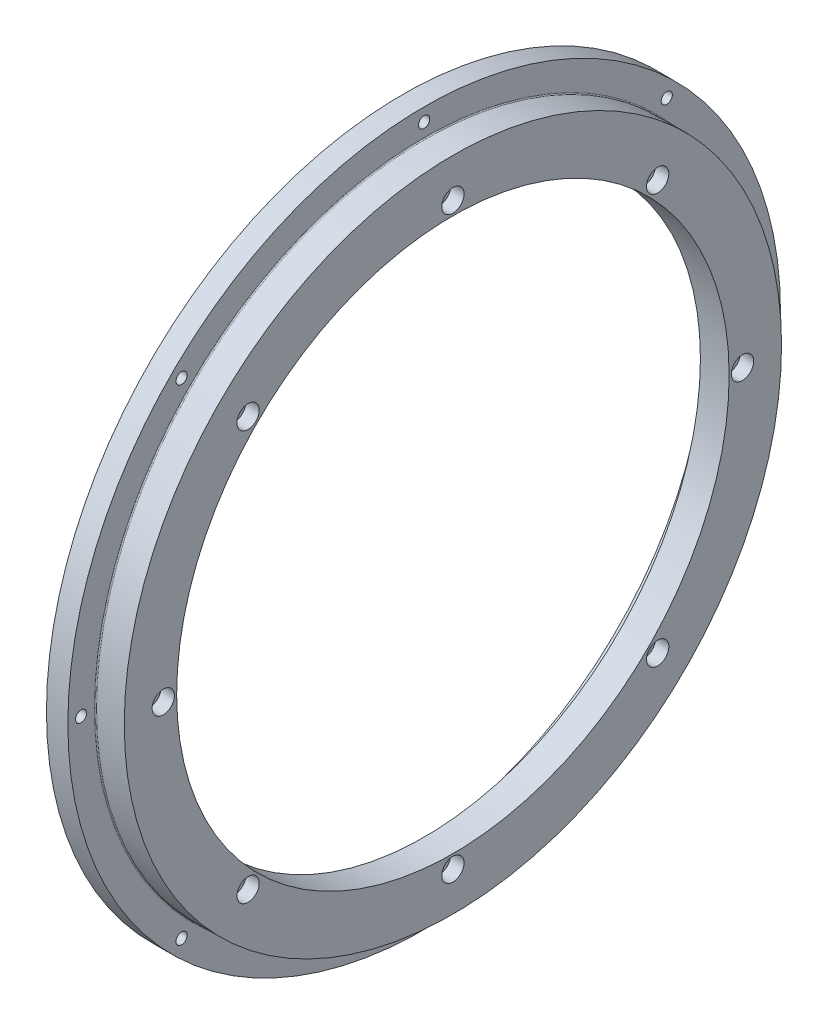
ISO-10303-21;
HEADER;
FILE_DESCRIPTION(('STEP AP214'),'2;1');
FILE_NAME('part.step','',(''),(''),'','','');
FILE_SCHEMA(('AUTOMOTIVE_DESIGN { 1 0 10303 214 1 1 1 1 }'));
ENDSEC;
DATA;
#1=APPLICATION_CONTEXT('core data for automotive mechanical design processes');
#2=APPLICATION_PROTOCOL_DEFINITION('international standard','automotive_design',2000,#1);
#3=PRODUCT_CONTEXT('',#1,'mechanical');
#4=PRODUCT('Part','Part','',(#3));
#5=PRODUCT_RELATED_PRODUCT_CATEGORY('part','',(#4));
#6=PRODUCT_DEFINITION_FORMATION('','',#4);
#7=PRODUCT_DEFINITION_CONTEXT('part definition',#1,'design');
#8=PRODUCT_DEFINITION('design','',#6,#7);
#9=PRODUCT_DEFINITION_SHAPE('','',#8);
#10=(LENGTH_UNIT() NAMED_UNIT(*) SI_UNIT(.MILLI.,.METRE.));
#11=(NAMED_UNIT(*) PLANE_ANGLE_UNIT() SI_UNIT($,.RADIAN.));
#12=(NAMED_UNIT(*) SI_UNIT($,.STERADIAN.) SOLID_ANGLE_UNIT());
#13=UNCERTAINTY_MEASURE_WITH_UNIT(LENGTH_MEASURE(1.E-05),#10,'distance_accuracy_value','');
#14=(GEOMETRIC_REPRESENTATION_CONTEXT(3) GLOBAL_UNCERTAINTY_ASSIGNED_CONTEXT((#13)) GLOBAL_UNIT_ASSIGNED_CONTEXT((#10,
#11,#12)) REPRESENTATION_CONTEXT('',''));
#15=CARTESIAN_POINT('',(0.,0.,0.));
#16=DIRECTION('',(0.,0.,1.));
#17=DIRECTION('',(1.,0.,0.));
#18=AXIS2_PLACEMENT_3D('',#15,#16,#17);
#19=CARTESIAN_POINT('',(-17.8562,-145.9291722,-145.9291722));
#20=DIRECTION('',(1.,0.,0.));
#21=DIRECTION('',(0.,0.,-1.));
#22=AXIS2_PLACEMENT_3D('',#19,#20,#21);
#23=CYLINDRICAL_SURFACE('',#22,5.1562);
#24=CARTESIAN_POINT('',(-2.6162,-145.9291722,-145.9291722));
#25=DIRECTION('',(1.,0.,0.));
#26=DIRECTION('',(0.,0.,-1.));
#27=AXIS2_PLACEMENT_3D('',#24,#25,#26);
#28=CIRCLE('',#27,5.1562);
#29=CARTESIAN_POINT('',(-2.6162,-145.9291722,-151.0853722));
#30=VERTEX_POINT('',#29);
#31=EDGE_CURVE('E84',#30,#30,#28,.T.);
#32=ORIENTED_EDGE('',*,*,#31,.F.);
#33=EDGE_LOOP('',(#32));
#34=FACE_BOUND('',#33,.T.);
#35=CARTESIAN_POINT('',(8.3312,-145.9291722,-145.9291722));
#36=DIRECTION('',(1.,0.,0.));
#37=DIRECTION('',(0.,0.,-1.));
#38=AXIS2_PLACEMENT_3D('',#35,#36,#37);
#39=CIRCLE('',#38,5.1562);
#40=CARTESIAN_POINT('',(8.3312,-145.9291722,-151.0853722));
#41=VERTEX_POINT('',#40);
#42=EDGE_CURVE('E45',#41,#41,#39,.F.);
#43=ORIENTED_EDGE('',*,*,#42,.F.);
#44=EDGE_LOOP('',(#43));
#45=FACE_BOUND('',#44,.T.);
#46=ADVANCED_FACE('F41',(#34,#45),#23,.F.);
#47=CARTESIAN_POINT('',(-17.8562,-206.375,0.));
#48=DIRECTION('',(1.,0.,0.));
#49=DIRECTION('',(0.,0.,-1.));
#50=AXIS2_PLACEMENT_3D('',#47,#48,#49);
#51=CYLINDRICAL_SURFACE('',#50,5.1562);
#52=CARTESIAN_POINT('',(-2.6162,-206.375,0.));
#53=DIRECTION('',(1.,0.,0.));
#54=DIRECTION('',(0.,0.,-1.));
#55=AXIS2_PLACEMENT_3D('',#52,#53,#54);
#56=CIRCLE('',#55,5.1562);
#57=CARTESIAN_POINT('',(-2.6162,-206.375,-5.1562));
#58=VERTEX_POINT('',#57);
#59=EDGE_CURVE('E87',#58,#58,#56,.T.);
#60=ORIENTED_EDGE('',*,*,#59,.F.);
#61=EDGE_LOOP('',(#60));
#62=FACE_BOUND('',#61,.T.);
#63=CARTESIAN_POINT('',(8.3312,-206.375,0.));
#64=DIRECTION('',(1.,0.,0.));
#65=DIRECTION('',(0.,0.,-1.));
#66=AXIS2_PLACEMENT_3D('',#63,#64,#65);
#67=CIRCLE('',#66,5.1562);
#68=CARTESIAN_POINT('',(8.3312,-206.375,-5.1562));
#69=VERTEX_POINT('',#68);
#70=EDGE_CURVE('E127',#69,#69,#67,.F.);
#71=ORIENTED_EDGE('',*,*,#70,.F.);
#72=EDGE_LOOP('',(#71));
#73=FACE_BOUND('',#72,.T.);
#74=ADVANCED_FACE('F137',(#62,#73),#51,.F.);
#75=CARTESIAN_POINT('',(-17.8562,-145.9291722,145.9291722));
#76=DIRECTION('',(1.,0.,0.));
#77=DIRECTION('',(0.,0.,-1.));
#78=AXIS2_PLACEMENT_3D('',#75,#76,#77);
#79=CYLINDRICAL_SURFACE('',#78,5.1562);
#80=CARTESIAN_POINT('',(-2.6162,-145.9291722,145.9291722));
#81=DIRECTION('',(1.,0.,0.));
#82=DIRECTION('',(0.,0.,-1.));
#83=AXIS2_PLACEMENT_3D('',#80,#81,#82);
#84=CIRCLE('',#83,5.1562);
#85=CARTESIAN_POINT('',(-2.6162,-145.9291722,140.7729722));
#86=VERTEX_POINT('',#85);
#87=EDGE_CURVE('E90',#86,#86,#84,.T.);
#88=ORIENTED_EDGE('',*,*,#87,.F.);
#89=EDGE_LOOP('',(#88));
#90=FACE_BOUND('',#89,.T.);
#91=CARTESIAN_POINT('',(8.3312,-145.9291722,145.9291722));
#92=DIRECTION('',(1.,0.,0.));
#93=DIRECTION('',(0.,0.,-1.));
#94=AXIS2_PLACEMENT_3D('',#91,#92,#93);
#95=CIRCLE('',#94,5.1562);
#96=CARTESIAN_POINT('',(8.3312,-145.9291722,140.7729722));
#97=VERTEX_POINT('',#96);
#98=EDGE_CURVE('E125',#97,#97,#95,.F.);
#99=ORIENTED_EDGE('',*,*,#98,.F.);
#100=EDGE_LOOP('',(#99));
#101=FACE_BOUND('',#100,.T.);
#102=ADVANCED_FACE('F144',(#90,#101),#79,.F.);
#103=CARTESIAN_POINT('',(-17.8562,0.,206.375));
#104=DIRECTION('',(1.,0.,0.));
#105=DIRECTION('',(0.,0.,-1.));
#106=AXIS2_PLACEMENT_3D('',#103,#104,#105);
#107=CYLINDRICAL_SURFACE('',#106,5.1562);
#108=CARTESIAN_POINT('',(-2.6162,0.,206.375));
#109=DIRECTION('',(1.,0.,0.));
#110=DIRECTION('',(0.,0.,-1.));
#111=AXIS2_PLACEMENT_3D('',#108,#109,#110);
#112=CIRCLE('',#111,5.1562);
#113=CARTESIAN_POINT('',(-2.6162,0.,201.2188));
#114=VERTEX_POINT('',#113);
#115=EDGE_CURVE('E93',#114,#114,#112,.T.);
#116=ORIENTED_EDGE('',*,*,#115,.F.);
#117=EDGE_LOOP('',(#116));
#118=FACE_BOUND('',#117,.T.);
#119=CARTESIAN_POINT('',(8.3312,0.,206.375));
#120=DIRECTION('',(1.,0.,0.));
#121=DIRECTION('',(0.,0.,-1.));
#122=AXIS2_PLACEMENT_3D('',#119,#120,#121);
#123=CIRCLE('',#122,5.1562);
#124=CARTESIAN_POINT('',(8.3312,0.,201.2188));
#125=VERTEX_POINT('',#124);
#126=EDGE_CURVE('E122',#125,#125,#123,.F.);
#127=ORIENTED_EDGE('',*,*,#126,.F.);
#128=EDGE_LOOP('',(#127));
#129=FACE_BOUND('',#128,.T.);
#130=ADVANCED_FACE('F376',(#118,#129),#107,.F.);
#131=CARTESIAN_POINT('',(-17.8562,145.9291722,145.9291722));
#132=DIRECTION('',(1.,0.,0.));
#133=DIRECTION('',(0.,0.,-1.));
#134=AXIS2_PLACEMENT_3D('',#131,#132,#133);
#135=CYLINDRICAL_SURFACE('',#134,5.1562);
#136=CARTESIAN_POINT('',(-2.6162,145.9291722,145.9291722));
#137=DIRECTION('',(1.,0.,0.));
#138=DIRECTION('',(0.,0.,-1.));
#139=AXIS2_PLACEMENT_3D('',#136,#137,#138);
#140=CIRCLE('',#139,5.1562);
#141=CARTESIAN_POINT('',(-2.6162,145.9291722,140.7729722));
#142=VERTEX_POINT('',#141);
#143=EDGE_CURVE('E96',#142,#142,#140,.T.);
#144=ORIENTED_EDGE('',*,*,#143,.F.);
#145=EDGE_LOOP('',(#144));
#146=FACE_BOUND('',#145,.T.);
#147=CARTESIAN_POINT('',(8.3312,145.9291722,145.9291722));
#148=DIRECTION('',(1.,0.,0.));
#149=DIRECTION('',(0.,0.,-1.));
#150=AXIS2_PLACEMENT_3D('',#147,#148,#149);
#151=CIRCLE('',#150,5.1562);
#152=CARTESIAN_POINT('',(8.3312,145.9291722,140.7729722));
#153=VERTEX_POINT('',#152);
#154=EDGE_CURVE('E119',#153,#153,#151,.F.);
#155=ORIENTED_EDGE('',*,*,#154,.F.);
#156=EDGE_LOOP('',(#155));
#157=FACE_BOUND('',#156,.T.);
#158=ADVANCED_FACE('F372',(#146,#157),#135,.F.);
#159=CARTESIAN_POINT('',(-17.8562,206.375,0.));
#160=DIRECTION('',(1.,0.,0.));
#161=DIRECTION('',(0.,0.,-1.));
#162=AXIS2_PLACEMENT_3D('',#159,#160,#161);
#163=CYLINDRICAL_SURFACE('',#162,5.1562);
#164=CARTESIAN_POINT('',(-2.6162,206.375,0.));
#165=DIRECTION('',(1.,0.,0.));
#166=DIRECTION('',(0.,0.,-1.));
#167=AXIS2_PLACEMENT_3D('',#164,#165,#166);
#168=CIRCLE('',#167,5.1562);
#169=CARTESIAN_POINT('',(-2.6162,206.375,-5.1562));
#170=VERTEX_POINT('',#169);
#171=EDGE_CURVE('E99',#170,#170,#168,.T.);
#172=ORIENTED_EDGE('',*,*,#171,.F.);
#173=EDGE_LOOP('',(#172));
#174=FACE_BOUND('',#173,.T.);
#175=CARTESIAN_POINT('',(8.3312,206.375,0.));
#176=DIRECTION('',(1.,0.,0.));
#177=DIRECTION('',(0.,0.,-1.));
#178=AXIS2_PLACEMENT_3D('',#175,#176,#177);
#179=CIRCLE('',#178,5.1562);
#180=CARTESIAN_POINT('',(8.3312,206.375,-5.1562));
#181=VERTEX_POINT('',#180);
#182=EDGE_CURVE('E116',#181,#181,#179,.F.);
#183=ORIENTED_EDGE('',*,*,#182,.F.);
#184=EDGE_LOOP('',(#183));
#185=FACE_BOUND('',#184,.T.);
#186=ADVANCED_FACE('F368',(#174,#185),#163,.F.);
#187=CARTESIAN_POINT('',(-17.8562,145.9291722,-145.9291722));
#188=DIRECTION('',(1.,0.,0.));
#189=DIRECTION('',(0.,0.,-1.));
#190=AXIS2_PLACEMENT_3D('',#187,#188,#189);
#191=CYLINDRICAL_SURFACE('',#190,5.1562);
#192=CARTESIAN_POINT('',(-2.6162,145.9291722,-145.9291722));
#193=DIRECTION('',(1.,0.,0.));
#194=DIRECTION('',(0.,0.,-1.));
#195=AXIS2_PLACEMENT_3D('',#192,#193,#194);
#196=CIRCLE('',#195,5.1562);
#197=CARTESIAN_POINT('',(-2.6162,145.9291722,-151.0853722));
#198=VERTEX_POINT('',#197);
#199=EDGE_CURVE('E102',#198,#198,#196,.T.);
#200=ORIENTED_EDGE('',*,*,#199,.F.);
#201=EDGE_LOOP('',(#200));
#202=FACE_BOUND('',#201,.T.);
#203=CARTESIAN_POINT('',(8.3312,145.9291722,-145.9291722));
#204=DIRECTION('',(1.,0.,0.));
#205=DIRECTION('',(0.,0.,-1.));
#206=AXIS2_PLACEMENT_3D('',#203,#204,#205);
#207=CIRCLE('',#206,5.1562);
#208=CARTESIAN_POINT('',(8.3312,145.9291722,-151.0853722));
#209=VERTEX_POINT('',#208);
#210=EDGE_CURVE('E112',#209,#209,#207,.F.);
#211=ORIENTED_EDGE('',*,*,#210,.F.);
#212=EDGE_LOOP('',(#211));
#213=FACE_BOUND('',#212,.T.);
#214=ADVANCED_FACE('F364',(#202,#213),#191,.F.);
#215=CARTESIAN_POINT('',(-17.8562,0.,-206.375));
#216=DIRECTION('',(1.,0.,0.));
#217=DIRECTION('',(0.,0.,-1.));
#218=AXIS2_PLACEMENT_3D('',#215,#216,#217);
#219=CYLINDRICAL_SURFACE('',#218,5.1562);
#220=CARTESIAN_POINT('',(-2.6162,0.,-206.375));
#221=DIRECTION('',(1.,0.,0.));
#222=DIRECTION('',(0.,0.,-1.));
#223=AXIS2_PLACEMENT_3D('',#220,#221,#222);
#224=CIRCLE('',#223,5.1562);
#225=CARTESIAN_POINT('',(-2.6162,0.,-211.5312));
#226=VERTEX_POINT('',#225);
#227=EDGE_CURVE('E105',#226,#226,#224,.T.);
#228=ORIENTED_EDGE('',*,*,#227,.F.);
#229=EDGE_LOOP('',(#228));
#230=FACE_BOUND('',#229,.T.);
#231=CARTESIAN_POINT('',(8.3312,0.,-206.375));
#232=DIRECTION('',(1.,0.,0.));
#233=DIRECTION('',(0.,0.,-1.));
#234=AXIS2_PLACEMENT_3D('',#231,#232,#233);
#235=CIRCLE('',#234,5.1562);
#236=CARTESIAN_POINT('',(8.3312,0.,-211.5312));
#237=VERTEX_POINT('',#236);
#238=EDGE_CURVE('E109',#237,#237,#235,.F.);
#239=ORIENTED_EDGE('',*,*,#238,.F.);
#240=EDGE_LOOP('',(#239));
#241=FACE_BOUND('',#240,.T.);
#242=ADVANCED_FACE('F212',(#230,#241),#219,.F.);
#243=CARTESIAN_POINT('',(-17.8562,0.,-215.9127));
#244=DIRECTION('',(1.,0.,0.));
#245=DIRECTION('',(0.,0.,-1.));
#246=AXIS2_PLACEMENT_3D('',#243,#244,#245);
#247=PLANE('',#246);
#248=CARTESIAN_POINT('',(-17.8562,0.,-244.475));
#249=DIRECTION('',(1.,0.,0.));
#250=DIRECTION('',(0.,0.,-1.));
#251=AXIS2_PLACEMENT_3D('',#248,#249,#250);
#252=CIRCLE('',#251,3.96874999999999);
#253=CARTESIAN_POINT('',(-17.8562,0.,-248.44375));
#254=VERTEX_POINT('',#253);
#255=EDGE_CURVE('E62',#254,#254,#252,.T.);
#256=ORIENTED_EDGE('',*,*,#255,.T.);
#257=EDGE_LOOP('',(#256));
#258=FACE_BOUND('',#257,.T.);
#259=CARTESIAN_POINT('',(-17.8562,172.8699362,-172.8699362));
#260=DIRECTION('',(1.,0.,0.));
#261=DIRECTION('',(0.,0.,-1.));
#262=AXIS2_PLACEMENT_3D('',#259,#260,#261);
#263=CIRCLE('',#262,3.96874999999999);
#264=CARTESIAN_POINT('',(-17.8562,172.8699362,-176.8386862));
#265=VERTEX_POINT('',#264);
#266=EDGE_CURVE('E263',#265,#265,#263,.T.);
#267=ORIENTED_EDGE('',*,*,#266,.T.);
#268=EDGE_LOOP('',(#267));
#269=FACE_BOUND('',#268,.T.);
#270=CARTESIAN_POINT('',(-17.8562,244.475,0.));
#271=DIRECTION('',(1.,0.,0.));
#272=DIRECTION('',(0.,0.,-1.));
#273=AXIS2_PLACEMENT_3D('',#270,#271,#272);
#274=CIRCLE('',#273,3.96875);
#275=CARTESIAN_POINT('',(-17.8562,244.475,-3.96875));
#276=VERTEX_POINT('',#275);
#277=EDGE_CURVE('E260',#276,#276,#274,.T.);
#278=ORIENTED_EDGE('',*,*,#277,.T.);
#279=EDGE_LOOP('',(#278));
#280=FACE_BOUND('',#279,.T.);
#281=CARTESIAN_POINT('',(-17.8562,172.8699362,172.8699362));
#282=DIRECTION('',(1.,0.,0.));
#283=DIRECTION('',(0.,0.,-1.));
#284=AXIS2_PLACEMENT_3D('',#281,#282,#283);
#285=CIRCLE('',#284,3.96874999999999);
#286=CARTESIAN_POINT('',(-17.8562,172.8699362,168.9011862));
#287=VERTEX_POINT('',#286);
#288=EDGE_CURVE('E257',#287,#287,#285,.T.);
#289=ORIENTED_EDGE('',*,*,#288,.T.);
#290=EDGE_LOOP('',(#289));
#291=FACE_BOUND('',#290,.T.);
#292=CARTESIAN_POINT('',(-17.8562,0.,244.475));
#293=DIRECTION('',(1.,0.,0.));
#294=DIRECTION('',(0.,0.,-1.));
#295=AXIS2_PLACEMENT_3D('',#292,#293,#294);
#296=CIRCLE('',#295,3.96874999999999);
#297=CARTESIAN_POINT('',(-17.8562,0.,240.50625));
#298=VERTEX_POINT('',#297);
#299=EDGE_CURVE('E254',#298,#298,#296,.T.);
#300=ORIENTED_EDGE('',*,*,#299,.T.);
#301=EDGE_LOOP('',(#300));
#302=FACE_BOUND('',#301,.T.);
#303=CARTESIAN_POINT('',(-17.8562,-172.8699362,172.8699362));
#304=DIRECTION('',(1.,0.,0.));
#305=DIRECTION('',(0.,0.,-1.));
#306=AXIS2_PLACEMENT_3D('',#303,#304,#305);
#307=CIRCLE('',#306,3.96874999999999);
#308=CARTESIAN_POINT('',(-17.8562,-172.8699362,168.9011862));
#309=VERTEX_POINT('',#308);
#310=EDGE_CURVE('E251',#309,#309,#307,.T.);
#311=ORIENTED_EDGE('',*,*,#310,.T.);
#312=EDGE_LOOP('',(#311));
#313=FACE_BOUND('',#312,.T.);
#314=CARTESIAN_POINT('',(-17.8562,-244.475,0.));
#315=DIRECTION('',(1.,0.,0.));
#316=DIRECTION('',(0.,0.,-1.));
#317=AXIS2_PLACEMENT_3D('',#314,#315,#316);
#318=CIRCLE('',#317,3.96875);
#319=CARTESIAN_POINT('',(-17.8562,-244.475,-3.96875));
#320=VERTEX_POINT('',#319);
#321=EDGE_CURVE('E248',#320,#320,#318,.T.);
#322=ORIENTED_EDGE('',*,*,#321,.T.);
#323=EDGE_LOOP('',(#322));
#324=FACE_BOUND('',#323,.T.);
#325=CARTESIAN_POINT('',(-17.8562,-172.8699362,-172.8699362));
#326=DIRECTION('',(1.,0.,0.));
#327=DIRECTION('',(0.,0.,-1.));
#328=AXIS2_PLACEMENT_3D('',#325,#326,#327);
#329=CIRCLE('',#328,3.96874999999999);
#330=CARTESIAN_POINT('',(-17.8562,-172.8699362,-176.8386862));
#331=VERTEX_POINT('',#330);
#332=EDGE_CURVE('E108',#331,#331,#329,.T.);
#333=ORIENTED_EDGE('',*,*,#332,.T.);
#334=EDGE_LOOP('',(#333));
#335=FACE_BOUND('',#334,.T.);
#336=CARTESIAN_POINT('',(-17.8562,0.,0.));
#337=DIRECTION('',(-1.,0.,0.));
#338=DIRECTION('',(0.,0.,1.));
#339=AXIS2_PLACEMENT_3D('',#336,#337,#338);
#340=CIRCLE('',#339,215.9127);
#341=CARTESIAN_POINT('',(-17.8562,0.,215.9127));
#342=VERTEX_POINT('',#341);
#343=EDGE_CURVE('E83',#342,#342,#340,.T.);
#344=ORIENTED_EDGE('',*,*,#343,.F.);
#345=EDGE_LOOP('',(#344));
#346=FACE_BOUND('',#345,.T.);
#347=CARTESIAN_POINT('',(-17.8562,0.,0.));
#348=DIRECTION('',(-1.,0.,0.));
#349=DIRECTION('',(0.,0.,1.));
#350=AXIS2_PLACEMENT_3D('',#347,#348,#349);
#351=CIRCLE('',#350,253.9111);
#352=CARTESIAN_POINT('',(-17.8562,0.,253.9111));
#353=VERTEX_POINT('',#352);
#354=EDGE_CURVE('E227',#353,#353,#351,.T.);
#355=ORIENTED_EDGE('',*,*,#354,.T.);
#356=EDGE_LOOP('',(#355));
#357=FACE_BOUND('',#356,.T.);
#358=ADVANCED_FACE('F209',(#258,#269,#280,#291,#302,#313,#324,#335,#346,#357),#247,.F.);
#359=CARTESIAN_POINT('',(-43.2562,0.,0.));
#360=DIRECTION('',(-1.,0.,0.));
#361=DIRECTION('',(0.,0.,1.));
#362=AXIS2_PLACEMENT_3D('',#359,#360,#361);
#363=CYLINDRICAL_SURFACE('',#362,253.9111);
#364=ORIENTED_EDGE('',*,*,#354,.F.);
#365=EDGE_LOOP('',(#364));
#366=FACE_BOUND('',#365,.T.);
#367=CARTESIAN_POINT('',(-2.6162,0.,0.));
#368=DIRECTION('',(-1.,0.,0.));
#369=DIRECTION('',(0.,0.,1.));
#370=AXIS2_PLACEMENT_3D('',#367,#368,#369);
#371=CIRCLE('',#370,253.9111);
#372=CARTESIAN_POINT('',(-2.6162,0.,253.9111));
#373=VERTEX_POINT('',#372);
#374=EDGE_CURVE('E230',#373,#373,#371,.T.);
#375=ORIENTED_EDGE('',*,*,#374,.T.);
#376=EDGE_LOOP('',(#375));
#377=FACE_BOUND('',#376,.T.);
#378=ADVANCED_FACE('F205',(#366,#377),#363,.T.);
#379=CARTESIAN_POINT('',(-2.6162,0.,-253.9111));
#380=DIRECTION('',(-1.,0.,0.));
#381=DIRECTION('',(0.,0.,1.));
#382=AXIS2_PLACEMENT_3D('',#379,#380,#381);
#383=PLANE('',#382);
#384=CARTESIAN_POINT('',(-2.6162,0.,-244.475));
#385=DIRECTION('',(-1.,0.,0.));
#386=DIRECTION('',(0.,0.,1.));
#387=AXIS2_PLACEMENT_3D('',#384,#385,#386);
#388=CIRCLE('',#387,3.96874999999999);
#389=CARTESIAN_POINT('',(-2.6162,0.,-240.50625));
#390=VERTEX_POINT('',#389);
#391=EDGE_CURVE('E80',#390,#390,#388,.F.);
#392=ORIENTED_EDGE('',*,*,#391,.F.);
#393=EDGE_LOOP('',(#392));
#394=FACE_BOUND('',#393,.T.);
#395=CARTESIAN_POINT('',(-2.6162,172.8699362,-172.8699362));
#396=DIRECTION('',(-1.,0.,0.));
#397=DIRECTION('',(0.,0.,1.));
#398=AXIS2_PLACEMENT_3D('',#395,#396,#397);
#399=CIRCLE('',#398,3.96874999999999);
#400=CARTESIAN_POINT('',(-2.6162,172.8699362,-168.9011862));
#401=VERTEX_POINT('',#400);
#402=EDGE_CURVE('E77',#401,#401,#399,.F.);
#403=ORIENTED_EDGE('',*,*,#402,.F.);
#404=EDGE_LOOP('',(#403));
#405=FACE_BOUND('',#404,.T.);
#406=CARTESIAN_POINT('',(-2.6162,244.475,0.));
#407=DIRECTION('',(-1.,0.,0.));
#408=DIRECTION('',(0.,0.,1.));
#409=AXIS2_PLACEMENT_3D('',#406,#407,#408);
#410=CIRCLE('',#409,3.96875);
#411=CARTESIAN_POINT('',(-2.6162,244.475,3.96875));
#412=VERTEX_POINT('',#411);
#413=EDGE_CURVE('E74',#412,#412,#410,.F.);
#414=ORIENTED_EDGE('',*,*,#413,.F.);
#415=EDGE_LOOP('',(#414));
#416=FACE_BOUND('',#415,.T.);
#417=CARTESIAN_POINT('',(-2.6162,172.8699362,172.8699362));
#418=DIRECTION('',(-1.,0.,0.));
#419=DIRECTION('',(0.,0.,1.));
#420=AXIS2_PLACEMENT_3D('',#417,#418,#419);
#421=CIRCLE('',#420,3.96874999999999);
#422=CARTESIAN_POINT('',(-2.6162,172.8699362,176.8386862));
#423=VERTEX_POINT('',#422);
#424=EDGE_CURVE('E71',#423,#423,#421,.F.);
#425=ORIENTED_EDGE('',*,*,#424,.F.);
#426=EDGE_LOOP('',(#425));
#427=FACE_BOUND('',#426,.T.);
#428=CARTESIAN_POINT('',(-2.6162,0.,244.475));
#429=DIRECTION('',(-1.,0.,0.));
#430=DIRECTION('',(0.,0.,1.));
#431=AXIS2_PLACEMENT_3D('',#428,#429,#430);
#432=CIRCLE('',#431,3.96874999999999);
#433=CARTESIAN_POINT('',(-2.6162,0.,248.44375));
#434=VERTEX_POINT('',#433);
#435=EDGE_CURVE('E68',#434,#434,#432,.F.);
#436=ORIENTED_EDGE('',*,*,#435,.F.);
#437=EDGE_LOOP('',(#436));
#438=FACE_BOUND('',#437,.T.);
#439=CARTESIAN_POINT('',(-2.6162,-172.8699362,172.8699362));
#440=DIRECTION('',(-1.,0.,0.));
#441=DIRECTION('',(0.,0.,1.));
#442=AXIS2_PLACEMENT_3D('',#439,#440,#441);
#443=CIRCLE('',#442,3.96874999999999);
#444=CARTESIAN_POINT('',(-2.6162,-172.8699362,176.8386862));
#445=VERTEX_POINT('',#444);
#446=EDGE_CURVE('E65',#445,#445,#443,.F.);
#447=ORIENTED_EDGE('',*,*,#446,.F.);
#448=EDGE_LOOP('',(#447));
#449=FACE_BOUND('',#448,.T.);
#450=CARTESIAN_POINT('',(-2.6162,-244.475,0.));
#451=DIRECTION('',(-1.,0.,0.));
#452=DIRECTION('',(0.,0.,1.));
#453=AXIS2_PLACEMENT_3D('',#450,#451,#452);
#454=CIRCLE('',#453,3.96875);
#455=CARTESIAN_POINT('',(-2.6162,-244.475,3.96875));
#456=VERTEX_POINT('',#455);
#457=EDGE_CURVE('E61',#456,#456,#454,.F.);
#458=ORIENTED_EDGE('',*,*,#457,.F.);
#459=EDGE_LOOP('',(#458));
#460=FACE_BOUND('',#459,.T.);
#461=CARTESIAN_POINT('',(-2.6162,-172.8699362,-172.8699362));
#462=DIRECTION('',(-1.,0.,0.));
#463=DIRECTION('',(0.,0.,1.));
#464=AXIS2_PLACEMENT_3D('',#461,#462,#463);
#465=CIRCLE('',#464,3.96874999999999);
#466=CARTESIAN_POINT('',(-2.6162,-172.8699362,-168.9011862));
#467=VERTEX_POINT('',#466);
#468=EDGE_CURVE('E58',#467,#467,#465,.F.);
#469=ORIENTED_EDGE('',*,*,#468,.F.);
#470=EDGE_LOOP('',(#469));
#471=FACE_BOUND('',#470,.T.);
#472=CARTESIAN_POINT('',(-2.6162,0.,0.));
#473=DIRECTION('',(-1.,0.,0.));
#474=DIRECTION('',(0.,0.,1.));
#475=AXIS2_PLACEMENT_3D('',#472,#473,#474);
#476=CIRCLE('',#475,234.95);
#477=CARTESIAN_POINT('',(-2.6162,0.,234.95));
#478=VERTEX_POINT('',#477);
#479=EDGE_CURVE('E225',#478,#478,#476,.T.);
#480=ORIENTED_EDGE('',*,*,#479,.T.);
#481=EDGE_LOOP('',(#480));
#482=FACE_BOUND('',#481,.T.);
#483=ORIENTED_EDGE('',*,*,#374,.F.);
#484=EDGE_LOOP('',(#483));
#485=FACE_BOUND('',#484,.T.);
#486=ADVANCED_FACE('F201',(#394,#405,#416,#427,#438,#449,#460,#471,#482,#485),#383,.F.);
#487=CARTESIAN_POINT('',(-43.2562,0.,0.));
#488=DIRECTION('',(-1.,0.,0.));
#489=DIRECTION('',(0.,0.,1.));
#490=AXIS2_PLACEMENT_3D('',#487,#488,#489);
#491=CYLINDRICAL_SURFACE('',#490,234.188);
#492=CARTESIAN_POINT('',(-1.8542,0.,0.));
#493=DIRECTION('',(-1.,0.,0.));
#494=DIRECTION('',(0.,0.,1.));
#495=AXIS2_PLACEMENT_3D('',#492,#493,#494);
#496=CIRCLE('',#495,234.188);
#497=CARTESIAN_POINT('',(-1.8542,0.,234.188));
#498=VERTEX_POINT('',#497);
#499=EDGE_CURVE('E54',#498,#498,#496,.F.);
#500=ORIENTED_EDGE('',*,*,#499,.T.);
#501=EDGE_LOOP('',(#500));
#502=FACE_BOUND('',#501,.T.);
#503=CARTESIAN_POINT('',(17.8562,0.,0.));
#504=DIRECTION('',(-1.,0.,0.));
#505=DIRECTION('',(0.,0.,1.));
#506=AXIS2_PLACEMENT_3D('',#503,#504,#505);
#507=CIRCLE('',#506,234.188);
#508=CARTESIAN_POINT('',(17.8562,0.,234.188));
#509=VERTEX_POINT('',#508);
#510=EDGE_CURVE('E235',#509,#509,#507,.T.);
#511=ORIENTED_EDGE('',*,*,#510,.T.);
#512=EDGE_LOOP('',(#511));
#513=FACE_BOUND('',#512,.T.);
#514=ADVANCED_FACE('F197',(#502,#513),#491,.T.);
#515=CARTESIAN_POINT('',(17.8562,0.,-234.188));
#516=DIRECTION('',(-1.,0.,0.));
#517=DIRECTION('',(0.,0.,1.));
#518=AXIS2_PLACEMENT_3D('',#515,#516,#517);
#519=PLANE('',#518);
#520=CARTESIAN_POINT('',(17.8562,0.,-206.375));
#521=DIRECTION('',(1.,0.,0.));
#522=DIRECTION('',(0.,0.,-1.));
#523=AXIS2_PLACEMENT_3D('',#520,#521,#522);
#524=CIRCLE('',#523,7.93750000000001);
#525=CARTESIAN_POINT('',(17.8562,0.,-214.3125));
#526=VERTEX_POINT('',#525);
#527=EDGE_CURVE('E310',#526,#526,#524,.T.);
#528=ORIENTED_EDGE('',*,*,#527,.F.);
#529=EDGE_LOOP('',(#528));
#530=FACE_BOUND('',#529,.T.);
#531=CARTESIAN_POINT('',(17.8562,145.9291722,-145.9291722));
#532=DIRECTION('',(1.,0.,0.));
#533=DIRECTION('',(0.,0.,-1.));
#534=AXIS2_PLACEMENT_3D('',#531,#532,#533);
#535=CIRCLE('',#534,7.93749999999999);
#536=CARTESIAN_POINT('',(17.8562,145.9291722,-153.8666722));
#537=VERTEX_POINT('',#536);
#538=EDGE_CURVE('E307',#537,#537,#535,.T.);
#539=ORIENTED_EDGE('',*,*,#538,.F.);
#540=EDGE_LOOP('',(#539));
#541=FACE_BOUND('',#540,.T.);
#542=CARTESIAN_POINT('',(17.8562,206.375,0.));
#543=DIRECTION('',(1.,0.,0.));
#544=DIRECTION('',(0.,0.,-1.));
#545=AXIS2_PLACEMENT_3D('',#542,#543,#544);
#546=CIRCLE('',#545,7.9375);
#547=CARTESIAN_POINT('',(17.8562,206.375,-7.9375));
#548=VERTEX_POINT('',#547);
#549=EDGE_CURVE('E301',#548,#548,#546,.T.);
#550=ORIENTED_EDGE('',*,*,#549,.F.);
#551=EDGE_LOOP('',(#550));
#552=FACE_BOUND('',#551,.T.);
#553=CARTESIAN_POINT('',(17.8562,145.9291722,145.9291722));
#554=DIRECTION('',(1.,0.,0.));
#555=DIRECTION('',(0.,0.,-1.));
#556=AXIS2_PLACEMENT_3D('',#553,#554,#555);
#557=CIRCLE('',#556,7.93749999999999);
#558=CARTESIAN_POINT('',(17.8562,145.9291722,137.9916722));
#559=VERTEX_POINT('',#558);
#560=EDGE_CURVE('E295',#559,#559,#557,.T.);
#561=ORIENTED_EDGE('',*,*,#560,.F.);
#562=EDGE_LOOP('',(#561));
#563=FACE_BOUND('',#562,.T.);
#564=CARTESIAN_POINT('',(17.8562,0.,206.375));
#565=DIRECTION('',(1.,0.,0.));
#566=DIRECTION('',(0.,0.,-1.));
#567=AXIS2_PLACEMENT_3D('',#564,#565,#566);
#568=CIRCLE('',#567,7.93750000000001);
#569=CARTESIAN_POINT('',(17.8562,0.,198.4375));
#570=VERTEX_POINT('',#569);
#571=EDGE_CURVE('E289',#570,#570,#568,.T.);
#572=ORIENTED_EDGE('',*,*,#571,.F.);
#573=EDGE_LOOP('',(#572));
#574=FACE_BOUND('',#573,.T.);
#575=CARTESIAN_POINT('',(17.8562,-145.9291722,145.9291722));
#576=DIRECTION('',(1.,0.,0.));
#577=DIRECTION('',(0.,0.,-1.));
#578=AXIS2_PLACEMENT_3D('',#575,#576,#577);
#579=CIRCLE('',#578,7.93749999999999);
#580=CARTESIAN_POINT('',(17.8562,-145.9291722,137.9916722));
#581=VERTEX_POINT('',#580);
#582=EDGE_CURVE('E283',#581,#581,#579,.T.);
#583=ORIENTED_EDGE('',*,*,#582,.F.);
#584=EDGE_LOOP('',(#583));
#585=FACE_BOUND('',#584,.T.);
#586=CARTESIAN_POINT('',(17.8562,-206.375,0.));
#587=DIRECTION('',(1.,0.,0.));
#588=DIRECTION('',(0.,0.,-1.));
#589=AXIS2_PLACEMENT_3D('',#586,#587,#588);
#590=CIRCLE('',#589,7.9375);
#591=CARTESIAN_POINT('',(17.8562,-206.375,-7.9375));
#592=VERTEX_POINT('',#591);
#593=EDGE_CURVE('E277',#592,#592,#590,.T.);
#594=ORIENTED_EDGE('',*,*,#593,.F.);
#595=EDGE_LOOP('',(#594));
#596=FACE_BOUND('',#595,.T.);
#597=CARTESIAN_POINT('',(17.8562,-145.9291722,-145.9291722));
#598=DIRECTION('',(1.,0.,0.));
#599=DIRECTION('',(0.,0.,-1.));
#600=AXIS2_PLACEMENT_3D('',#597,#598,#599);
#601=CIRCLE('',#600,7.93749999999999);
#602=CARTESIAN_POINT('',(17.8562,-145.9291722,-153.8666722));
#603=VERTEX_POINT('',#602);
#604=EDGE_CURVE('E271',#603,#603,#601,.T.);
#605=ORIENTED_EDGE('',*,*,#604,.F.);
#606=EDGE_LOOP('',(#605));
#607=FACE_BOUND('',#606,.T.);
#608=ORIENTED_EDGE('',*,*,#510,.F.);
#609=EDGE_LOOP('',(#608));
#610=FACE_BOUND('',#609,.T.);
#611=CARTESIAN_POINT('',(17.8562,0.,0.));
#612=DIRECTION('',(-1.,0.,0.));
#613=DIRECTION('',(0.,0.,1.));
#614=AXIS2_PLACEMENT_3D('',#611,#612,#613);
#615=CIRCLE('',#614,196.85);
#616=CARTESIAN_POINT('',(17.8562,0.,196.85));
#617=VERTEX_POINT('',#616);
#618=EDGE_CURVE('E238',#617,#617,#615,.T.);
#619=ORIENTED_EDGE('',*,*,#618,.T.);
#620=EDGE_LOOP('',(#619));
#621=FACE_BOUND('',#620,.T.);
#622=ADVANCED_FACE('F193',(#530,#541,#552,#563,#574,#585,#596,#607,#610,#621),#519,.F.);
#623=CARTESIAN_POINT('',(-43.2562,0.,0.));
#624=DIRECTION('',(-1.,0.,0.));
#625=DIRECTION('',(0.,0.,1.));
#626=AXIS2_PLACEMENT_3D('',#623,#624,#625);
#627=CYLINDRICAL_SURFACE('',#626,196.85);
#628=ORIENTED_EDGE('',*,*,#618,.F.);
#629=EDGE_LOOP('',(#628));
#630=FACE_BOUND('',#629,.T.);
#631=CARTESIAN_POINT('',(-2.6162,0.,0.));
#632=DIRECTION('',(-1.,0.,0.));
#633=DIRECTION('',(0.,0.,1.));
#634=AXIS2_PLACEMENT_3D('',#631,#632,#633);
#635=CIRCLE('',#634,196.85);
#636=CARTESIAN_POINT('',(-2.6162,0.,196.85));
#637=VERTEX_POINT('',#636);
#638=EDGE_CURVE('E241',#637,#637,#635,.T.);
#639=ORIENTED_EDGE('',*,*,#638,.T.);
#640=EDGE_LOOP('',(#639));
#641=FACE_BOUND('',#640,.T.);
#642=ADVANCED_FACE('F189',(#630,#641),#627,.F.);
#643=CARTESIAN_POINT('',(-2.6162,0.,-196.85));
#644=DIRECTION('',(1.,0.,0.));
#645=DIRECTION('',(0.,0.,-1.));
#646=AXIS2_PLACEMENT_3D('',#643,#644,#645);
#647=PLANE('',#646);
#648=ORIENTED_EDGE('',*,*,#227,.T.);
#649=EDGE_LOOP('',(#648));
#650=FACE_BOUND('',#649,.T.);
#651=ORIENTED_EDGE('',*,*,#199,.T.);
#652=EDGE_LOOP('',(#651));
#653=FACE_BOUND('',#652,.T.);
#654=ORIENTED_EDGE('',*,*,#171,.T.);
#655=EDGE_LOOP('',(#654));
#656=FACE_BOUND('',#655,.T.);
#657=ORIENTED_EDGE('',*,*,#143,.T.);
#658=EDGE_LOOP('',(#657));
#659=FACE_BOUND('',#658,.T.);
#660=ORIENTED_EDGE('',*,*,#115,.T.);
#661=EDGE_LOOP('',(#660));
#662=FACE_BOUND('',#661,.T.);
#663=ORIENTED_EDGE('',*,*,#87,.T.);
#664=EDGE_LOOP('',(#663));
#665=FACE_BOUND('',#664,.T.);
#666=ORIENTED_EDGE('',*,*,#59,.T.);
#667=EDGE_LOOP('',(#666));
#668=FACE_BOUND('',#667,.T.);
#669=ORIENTED_EDGE('',*,*,#31,.T.);
#670=EDGE_LOOP('',(#669));
#671=FACE_BOUND('',#670,.T.);
#672=CARTESIAN_POINT('',(-2.6162,0.,0.));
#673=DIRECTION('',(1.,0.,0.));
#674=DIRECTION('',(0.,0.,-1.));
#675=AXIS2_PLACEMENT_3D('',#672,#673,#674);
#676=CIRCLE('',#675,215.1507);
#677=CARTESIAN_POINT('',(-2.6162,0.,-215.1507));
#678=VERTEX_POINT('',#677);
#679=EDGE_CURVE('E49',#678,#678,#676,.F.);
#680=ORIENTED_EDGE('',*,*,#679,.T.);
#681=EDGE_LOOP('',(#680));
#682=FACE_BOUND('',#681,.T.);
#683=ORIENTED_EDGE('',*,*,#638,.F.);
#684=EDGE_LOOP('',(#683));
#685=FACE_BOUND('',#684,.T.);
#686=ADVANCED_FACE('F187',(#650,#653,#656,#659,#662,#665,#668,#671,#682,#685),#647,.F.);
#687=CARTESIAN_POINT('',(-43.2562,0.,0.));
#688=DIRECTION('',(-1.,0.,0.));
#689=DIRECTION('',(0.,0.,1.));
#690=AXIS2_PLACEMENT_3D('',#687,#688,#689);
#691=CYLINDRICAL_SURFACE('',#690,215.9127);
#692=CARTESIAN_POINT('',(-3.3782,0.,0.));
#693=DIRECTION('',(1.,0.,0.));
#694=DIRECTION('',(0.,0.,-1.));
#695=AXIS2_PLACEMENT_3D('',#692,#693,#694);
#696=CIRCLE('',#695,215.9127);
#697=CARTESIAN_POINT('',(-3.3782,0.,-215.9127));
#698=VERTEX_POINT('',#697);
#699=EDGE_CURVE('E10',#698,#698,#696,.T.);
#700=ORIENTED_EDGE('',*,*,#699,.T.);
#701=EDGE_LOOP('',(#700));
#702=FACE_BOUND('',#701,.T.);
#703=ORIENTED_EDGE('',*,*,#343,.T.);
#704=EDGE_LOOP('',(#703));
#705=FACE_BOUND('',#704,.T.);
#706=ADVANCED_FACE('F183',(#702,#705),#691,.F.);
#707=CARTESIAN_POINT('',(-1.8542,0.,0.));
#708=DIRECTION('',(-1.,0.,0.));
#709=DIRECTION('',(0.,0.,1.));
#710=AXIS2_PLACEMENT_3D('',#707,#708,#709);
#711=TOROIDAL_SURFACE('',#710,234.95,0.762);
#712=ORIENTED_EDGE('',*,*,#499,.F.);
#713=EDGE_LOOP('',(#712));
#714=FACE_BOUND('',#713,.T.);
#715=ORIENTED_EDGE('',*,*,#479,.F.);
#716=EDGE_LOOP('',(#715));
#717=FACE_BOUND('',#716,.T.);
#718=ADVANCED_FACE('F186',(#714,#717),#711,.F.);
#719=CARTESIAN_POINT('',(-3.3782,0.,0.));
#720=DIRECTION('',(1.,0.,0.));
#721=DIRECTION('',(0.,0.,-1.));
#722=AXIS2_PLACEMENT_3D('',#719,#720,#721);
#723=TOROIDAL_SURFACE('',#722,215.1507,0.762);
#724=ORIENTED_EDGE('',*,*,#699,.F.);
#725=EDGE_LOOP('',(#724));
#726=FACE_BOUND('',#725,.T.);
#727=ORIENTED_EDGE('',*,*,#679,.F.);
#728=EDGE_LOOP('',(#727));
#729=FACE_BOUND('',#728,.T.);
#730=ADVANCED_FACE('F43',(#726,#729),#723,.F.);
#731=CARTESIAN_POINT('',(17.8562,-172.8699362,-172.8699362));
#732=DIRECTION('',(-1.,0.,0.));
#733=DIRECTION('',(0.,0.,1.));
#734=AXIS2_PLACEMENT_3D('',#731,#732,#733);
#735=CYLINDRICAL_SURFACE('',#734,3.96874999999999);
#736=ORIENTED_EDGE('',*,*,#332,.F.);
#737=EDGE_LOOP('',(#736));
#738=FACE_BOUND('',#737,.T.);
#739=ORIENTED_EDGE('',*,*,#468,.T.);
#740=EDGE_LOOP('',(#739));
#741=FACE_BOUND('',#740,.T.);
#742=ADVANCED_FACE('F178',(#738,#741),#735,.F.);
#743=CARTESIAN_POINT('',(17.8562,-244.475,0.));
#744=DIRECTION('',(-1.,0.,0.));
#745=DIRECTION('',(0.,0.,1.));
#746=AXIS2_PLACEMENT_3D('',#743,#744,#745);
#747=CYLINDRICAL_SURFACE('',#746,3.96875);
#748=ORIENTED_EDGE('',*,*,#321,.F.);
#749=EDGE_LOOP('',(#748));
#750=FACE_BOUND('',#749,.T.);
#751=ORIENTED_EDGE('',*,*,#457,.T.);
#752=EDGE_LOOP('',(#751));
#753=FACE_BOUND('',#752,.T.);
#754=ADVANCED_FACE('F174',(#750,#753),#747,.F.);
#755=CARTESIAN_POINT('',(17.8562,-172.8699362,172.8699362));
#756=DIRECTION('',(-1.,0.,0.));
#757=DIRECTION('',(0.,0.,1.));
#758=AXIS2_PLACEMENT_3D('',#755,#756,#757);
#759=CYLINDRICAL_SURFACE('',#758,3.96874999999999);
#760=ORIENTED_EDGE('',*,*,#310,.F.);
#761=EDGE_LOOP('',(#760));
#762=FACE_BOUND('',#761,.T.);
#763=ORIENTED_EDGE('',*,*,#446,.T.);
#764=EDGE_LOOP('',(#763));
#765=FACE_BOUND('',#764,.T.);
#766=ADVANCED_FACE('F170',(#762,#765),#759,.F.);
#767=CARTESIAN_POINT('',(17.8562,0.,244.475));
#768=DIRECTION('',(-1.,0.,0.));
#769=DIRECTION('',(0.,0.,1.));
#770=AXIS2_PLACEMENT_3D('',#767,#768,#769);
#771=CYLINDRICAL_SURFACE('',#770,3.96874999999999);
#772=ORIENTED_EDGE('',*,*,#299,.F.);
#773=EDGE_LOOP('',(#772));
#774=FACE_BOUND('',#773,.T.);
#775=ORIENTED_EDGE('',*,*,#435,.T.);
#776=EDGE_LOOP('',(#775));
#777=FACE_BOUND('',#776,.T.);
#778=ADVANCED_FACE('F166',(#774,#777),#771,.F.);
#779=CARTESIAN_POINT('',(17.8562,172.8699362,172.8699362));
#780=DIRECTION('',(-1.,0.,0.));
#781=DIRECTION('',(0.,0.,1.));
#782=AXIS2_PLACEMENT_3D('',#779,#780,#781);
#783=CYLINDRICAL_SURFACE('',#782,3.96874999999999);
#784=ORIENTED_EDGE('',*,*,#288,.F.);
#785=EDGE_LOOP('',(#784));
#786=FACE_BOUND('',#785,.T.);
#787=ORIENTED_EDGE('',*,*,#424,.T.);
#788=EDGE_LOOP('',(#787));
#789=FACE_BOUND('',#788,.T.);
#790=ADVANCED_FACE('F162',(#786,#789),#783,.F.);
#791=CARTESIAN_POINT('',(17.8562,244.475,0.));
#792=DIRECTION('',(-1.,0.,0.));
#793=DIRECTION('',(0.,0.,1.));
#794=AXIS2_PLACEMENT_3D('',#791,#792,#793);
#795=CYLINDRICAL_SURFACE('',#794,3.96875);
#796=ORIENTED_EDGE('',*,*,#277,.F.);
#797=EDGE_LOOP('',(#796));
#798=FACE_BOUND('',#797,.T.);
#799=ORIENTED_EDGE('',*,*,#413,.T.);
#800=EDGE_LOOP('',(#799));
#801=FACE_BOUND('',#800,.T.);
#802=ADVANCED_FACE('F158',(#798,#801),#795,.F.);
#803=CARTESIAN_POINT('',(17.8562,172.8699362,-172.8699362));
#804=DIRECTION('',(-1.,0.,0.));
#805=DIRECTION('',(0.,0.,1.));
#806=AXIS2_PLACEMENT_3D('',#803,#804,#805);
#807=CYLINDRICAL_SURFACE('',#806,3.96874999999999);
#808=ORIENTED_EDGE('',*,*,#266,.F.);
#809=EDGE_LOOP('',(#808));
#810=FACE_BOUND('',#809,.T.);
#811=ORIENTED_EDGE('',*,*,#402,.T.);
#812=EDGE_LOOP('',(#811));
#813=FACE_BOUND('',#812,.T.);
#814=ADVANCED_FACE('F154',(#810,#813),#807,.F.);
#815=CARTESIAN_POINT('',(17.8562,0.,-244.475));
#816=DIRECTION('',(-1.,0.,0.));
#817=DIRECTION('',(0.,0.,1.));
#818=AXIS2_PLACEMENT_3D('',#815,#816,#817);
#819=CYLINDRICAL_SURFACE('',#818,3.96874999999999);
#820=ORIENTED_EDGE('',*,*,#255,.F.);
#821=EDGE_LOOP('',(#820));
#822=FACE_BOUND('',#821,.T.);
#823=ORIENTED_EDGE('',*,*,#391,.T.);
#824=EDGE_LOOP('',(#823));
#825=FACE_BOUND('',#824,.T.);
#826=ADVANCED_FACE('F150',(#822,#825),#819,.F.);
#827=CARTESIAN_POINT('',(8.3312,0.,-206.375));
#828=DIRECTION('',(1.,0.,0.));
#829=DIRECTION('',(0.,0.,-1.));
#830=AXIS2_PLACEMENT_3D('',#827,#828,#829);
#831=PLANE('',#830);
#832=CARTESIAN_POINT('',(8.3312,0.,-206.375));
#833=DIRECTION('',(1.,0.,0.));
#834=DIRECTION('',(0.,0.,-1.));
#835=AXIS2_PLACEMENT_3D('',#832,#833,#834);
#836=CIRCLE('',#835,7.93750000000001);
#837=CARTESIAN_POINT('',(8.3312,0.,-214.3125));
#838=VERTEX_POINT('',#837);
#839=EDGE_CURVE('E113',#838,#838,#836,.T.);
#840=ORIENTED_EDGE('',*,*,#839,.T.);
#841=EDGE_LOOP('',(#840));
#842=FACE_BOUND('',#841,.T.);
#843=ORIENTED_EDGE('',*,*,#238,.T.);
#844=EDGE_LOOP('',(#843));
#845=FACE_BOUND('',#844,.T.);
#846=ADVANCED_FACE('F153',(#842,#845),#831,.T.);
#847=CARTESIAN_POINT('',(8.3312,0.,-206.375));
#848=DIRECTION('',(1.,0.,0.));
#849=DIRECTION('',(0.,0.,-1.));
#850=AXIS2_PLACEMENT_3D('',#847,#848,#849);
#851=CYLINDRICAL_SURFACE('',#850,7.93750000000001);
#852=ORIENTED_EDGE('',*,*,#839,.F.);
#853=EDGE_LOOP('',(#852));
#854=FACE_BOUND('',#853,.T.);
#855=ORIENTED_EDGE('',*,*,#527,.T.);
#856=EDGE_LOOP('',(#855));
#857=FACE_BOUND('',#856,.T.);
#858=ADVANCED_FACE('F318',(#854,#857),#851,.F.);
#859=CARTESIAN_POINT('',(8.3312,145.9291722,-145.9291722));
#860=DIRECTION('',(1.,0.,0.));
#861=DIRECTION('',(0.,0.,-1.));
#862=AXIS2_PLACEMENT_3D('',#859,#860,#861);
#863=PLANE('',#862);
#864=CARTESIAN_POINT('',(8.3312,145.9291722,-145.9291722));
#865=DIRECTION('',(1.,0.,0.));
#866=DIRECTION('',(0.,0.,-1.));
#867=AXIS2_PLACEMENT_3D('',#864,#865,#866);
#868=CIRCLE('',#867,7.93749999999999);
#869=CARTESIAN_POINT('',(8.3312,145.9291722,-153.8666722));
#870=VERTEX_POINT('',#869);
#871=EDGE_CURVE('E304',#870,#870,#868,.T.);
#872=ORIENTED_EDGE('',*,*,#871,.T.);
#873=EDGE_LOOP('',(#872));
#874=FACE_BOUND('',#873,.T.);
#875=ORIENTED_EDGE('',*,*,#210,.T.);
#876=EDGE_LOOP('',(#875));
#877=FACE_BOUND('',#876,.T.);
#878=ADVANCED_FACE('F321',(#874,#877),#863,.T.);
#879=CARTESIAN_POINT('',(8.3312,145.9291722,-145.9291722));
#880=DIRECTION('',(1.,0.,0.));
#881=DIRECTION('',(0.,0.,-1.));
#882=AXIS2_PLACEMENT_3D('',#879,#880,#881);
#883=CYLINDRICAL_SURFACE('',#882,7.93749999999999);
#884=ORIENTED_EDGE('',*,*,#871,.F.);
#885=EDGE_LOOP('',(#884));
#886=FACE_BOUND('',#885,.T.);
#887=ORIENTED_EDGE('',*,*,#538,.T.);
#888=EDGE_LOOP('',(#887));
#889=FACE_BOUND('',#888,.T.);
#890=ADVANCED_FACE('F478',(#886,#889),#883,.F.);
#891=CARTESIAN_POINT('',(8.3312,206.375,0.));
#892=DIRECTION('',(1.,0.,0.));
#893=DIRECTION('',(0.,0.,-1.));
#894=AXIS2_PLACEMENT_3D('',#891,#892,#893);
#895=PLANE('',#894);
#896=CARTESIAN_POINT('',(8.3312,206.375,0.));
#897=DIRECTION('',(1.,0.,0.));
#898=DIRECTION('',(0.,0.,-1.));
#899=AXIS2_PLACEMENT_3D('',#896,#897,#898);
#900=CIRCLE('',#899,7.9375);
#901=CARTESIAN_POINT('',(8.3312,206.375,-7.9375));
#902=VERTEX_POINT('',#901);
#903=EDGE_CURVE('E298',#902,#902,#900,.T.);
#904=ORIENTED_EDGE('',*,*,#903,.T.);
#905=EDGE_LOOP('',(#904));
#906=FACE_BOUND('',#905,.T.);
#907=ORIENTED_EDGE('',*,*,#182,.T.);
#908=EDGE_LOOP('',(#907));
#909=FACE_BOUND('',#908,.T.);
#910=ADVANCED_FACE('F468',(#906,#909),#895,.T.);
#911=CARTESIAN_POINT('',(8.3312,206.375,0.));
#912=DIRECTION('',(1.,0.,0.));
#913=DIRECTION('',(0.,0.,-1.));
#914=AXIS2_PLACEMENT_3D('',#911,#912,#913);
#915=CYLINDRICAL_SURFACE('',#914,7.9375);
#916=ORIENTED_EDGE('',*,*,#903,.F.);
#917=EDGE_LOOP('',(#916));
#918=FACE_BOUND('',#917,.T.);
#919=ORIENTED_EDGE('',*,*,#549,.T.);
#920=EDGE_LOOP('',(#919));
#921=FACE_BOUND('',#920,.T.);
#922=ADVANCED_FACE('F458',(#918,#921),#915,.F.);
#923=CARTESIAN_POINT('',(8.3312,145.9291722,145.9291722));
#924=DIRECTION('',(1.,0.,0.));
#925=DIRECTION('',(0.,0.,-1.));
#926=AXIS2_PLACEMENT_3D('',#923,#924,#925);
#927=PLANE('',#926);
#928=CARTESIAN_POINT('',(8.3312,145.9291722,145.9291722));
#929=DIRECTION('',(1.,0.,0.));
#930=DIRECTION('',(0.,0.,-1.));
#931=AXIS2_PLACEMENT_3D('',#928,#929,#930);
#932=CIRCLE('',#931,7.93749999999999);
#933=CARTESIAN_POINT('',(8.3312,145.9291722,137.9916722));
#934=VERTEX_POINT('',#933);
#935=EDGE_CURVE('E292',#934,#934,#932,.T.);
#936=ORIENTED_EDGE('',*,*,#935,.T.);
#937=EDGE_LOOP('',(#936));
#938=FACE_BOUND('',#937,.T.);
#939=ORIENTED_EDGE('',*,*,#154,.T.);
#940=EDGE_LOOP('',(#939));
#941=FACE_BOUND('',#940,.T.);
#942=ADVANCED_FACE('F448',(#938,#941),#927,.T.);
#943=CARTESIAN_POINT('',(8.3312,145.9291722,145.9291722));
#944=DIRECTION('',(1.,0.,0.));
#945=DIRECTION('',(0.,0.,-1.));
#946=AXIS2_PLACEMENT_3D('',#943,#944,#945);
#947=CYLINDRICAL_SURFACE('',#946,7.93749999999999);
#948=ORIENTED_EDGE('',*,*,#935,.F.);
#949=EDGE_LOOP('',(#948));
#950=FACE_BOUND('',#949,.T.);
#951=ORIENTED_EDGE('',*,*,#560,.T.);
#952=EDGE_LOOP('',(#951));
#953=FACE_BOUND('',#952,.T.);
#954=ADVANCED_FACE('F439',(#950,#953),#947,.F.);
#955=CARTESIAN_POINT('',(8.3312,0.,206.375));
#956=DIRECTION('',(1.,0.,0.));
#957=DIRECTION('',(0.,0.,-1.));
#958=AXIS2_PLACEMENT_3D('',#955,#956,#957);
#959=PLANE('',#958);
#960=CARTESIAN_POINT('',(8.3312,0.,206.375));
#961=DIRECTION('',(1.,0.,0.));
#962=DIRECTION('',(0.,0.,-1.));
#963=AXIS2_PLACEMENT_3D('',#960,#961,#962);
#964=CIRCLE('',#963,7.93750000000001);
#965=CARTESIAN_POINT('',(8.3312,0.,198.4375));
#966=VERTEX_POINT('',#965);
#967=EDGE_CURVE('E286',#966,#966,#964,.T.);
#968=ORIENTED_EDGE('',*,*,#967,.T.);
#969=EDGE_LOOP('',(#968));
#970=FACE_BOUND('',#969,.T.);
#971=ORIENTED_EDGE('',*,*,#126,.T.);
#972=EDGE_LOOP('',(#971));
#973=FACE_BOUND('',#972,.T.);
#974=ADVANCED_FACE('F400',(#970,#973),#959,.T.);
#975=CARTESIAN_POINT('',(8.3312,0.,206.375));
#976=DIRECTION('',(1.,0.,0.));
#977=DIRECTION('',(0.,0.,-1.));
#978=AXIS2_PLACEMENT_3D('',#975,#976,#977);
#979=CYLINDRICAL_SURFACE('',#978,7.93750000000001);
#980=ORIENTED_EDGE('',*,*,#967,.F.);
#981=EDGE_LOOP('',(#980));
#982=FACE_BOUND('',#981,.T.);
#983=ORIENTED_EDGE('',*,*,#571,.T.);
#984=EDGE_LOOP('',(#983));
#985=FACE_BOUND('',#984,.T.);
#986=ADVANCED_FACE('F391',(#982,#985),#979,.F.);
#987=CARTESIAN_POINT('',(8.3312,-145.9291722,145.9291722));
#988=DIRECTION('',(1.,0.,0.));
#989=DIRECTION('',(0.,0.,-1.));
#990=AXIS2_PLACEMENT_3D('',#987,#988,#989);
#991=PLANE('',#990);
#992=CARTESIAN_POINT('',(8.3312,-145.9291722,145.9291722));
#993=DIRECTION('',(1.,0.,0.));
#994=DIRECTION('',(0.,0.,-1.));
#995=AXIS2_PLACEMENT_3D('',#992,#993,#994);
#996=CIRCLE('',#995,7.93749999999999);
#997=CARTESIAN_POINT('',(8.3312,-145.9291722,137.9916722));
#998=VERTEX_POINT('',#997);
#999=EDGE_CURVE('E280',#998,#998,#996,.T.);
#1000=ORIENTED_EDGE('',*,*,#999,.T.);
#1001=EDGE_LOOP('',(#1000));
#1002=FACE_BOUND('',#1001,.T.);
#1003=ORIENTED_EDGE('',*,*,#98,.T.);
#1004=EDGE_LOOP('',(#1003));
#1005=FACE_BOUND('',#1004,.T.);
#1006=ADVANCED_FACE('F388',(#1002,#1005),#991,.T.);
#1007=CARTESIAN_POINT('',(8.3312,-145.9291722,145.9291722));
#1008=DIRECTION('',(1.,0.,0.));
#1009=DIRECTION('',(0.,0.,-1.));
#1010=AXIS2_PLACEMENT_3D('',#1007,#1008,#1009);
#1011=CYLINDRICAL_SURFACE('',#1010,7.93749999999999);
#1012=ORIENTED_EDGE('',*,*,#999,.F.);
#1013=EDGE_LOOP('',(#1012));
#1014=FACE_BOUND('',#1013,.T.);
#1015=ORIENTED_EDGE('',*,*,#582,.T.);
#1016=EDGE_LOOP('',(#1015));
#1017=FACE_BOUND('',#1016,.T.);
#1018=ADVANCED_FACE('F390',(#1014,#1017),#1011,.F.);
#1019=CARTESIAN_POINT('',(8.3312,-206.375,0.));
#1020=DIRECTION('',(1.,0.,0.));
#1021=DIRECTION('',(0.,0.,-1.));
#1022=AXIS2_PLACEMENT_3D('',#1019,#1020,#1021);
#1023=PLANE('',#1022);
#1024=CARTESIAN_POINT('',(8.3312,-206.375,0.));
#1025=DIRECTION('',(1.,0.,0.));
#1026=DIRECTION('',(0.,0.,-1.));
#1027=AXIS2_PLACEMENT_3D('',#1024,#1025,#1026);
#1028=CIRCLE('',#1027,7.9375);
#1029=CARTESIAN_POINT('',(8.3312,-206.375,-7.9375));
#1030=VERTEX_POINT('',#1029);
#1031=EDGE_CURVE('E274',#1030,#1030,#1028,.T.);
#1032=ORIENTED_EDGE('',*,*,#1031,.T.);
#1033=EDGE_LOOP('',(#1032));
#1034=FACE_BOUND('',#1033,.T.);
#1035=ORIENTED_EDGE('',*,*,#70,.T.);
#1036=EDGE_LOOP('',(#1035));
#1037=FACE_BOUND('',#1036,.T.);
#1038=ADVANCED_FACE('F359',(#1034,#1037),#1023,.T.);
#1039=CARTESIAN_POINT('',(8.3312,-206.375,0.));
#1040=DIRECTION('',(1.,0.,0.));
#1041=DIRECTION('',(0.,0.,-1.));
#1042=AXIS2_PLACEMENT_3D('',#1039,#1040,#1041);
#1043=CYLINDRICAL_SURFACE('',#1042,7.9375);
#1044=ORIENTED_EDGE('',*,*,#1031,.F.);
#1045=EDGE_LOOP('',(#1044));
#1046=FACE_BOUND('',#1045,.T.);
#1047=ORIENTED_EDGE('',*,*,#593,.T.);
#1048=EDGE_LOOP('',(#1047));
#1049=FACE_BOUND('',#1048,.T.);
#1050=ADVANCED_FACE('F354',(#1046,#1049),#1043,.F.);
#1051=CARTESIAN_POINT('',(8.3312,-145.9291722,-145.9291722));
#1052=DIRECTION('',(1.,0.,0.));
#1053=DIRECTION('',(0.,0.,-1.));
#1054=AXIS2_PLACEMENT_3D('',#1051,#1052,#1053);
#1055=PLANE('',#1054);
#1056=CARTESIAN_POINT('',(8.3312,-145.9291722,-145.9291722));
#1057=DIRECTION('',(1.,0.,0.));
#1058=DIRECTION('',(0.,0.,-1.));
#1059=AXIS2_PLACEMENT_3D('',#1056,#1057,#1058);
#1060=CIRCLE('',#1059,7.93749999999999);
#1061=CARTESIAN_POINT('',(8.3312,-145.9291722,-153.8666722));
#1062=VERTEX_POINT('',#1061);
#1063=EDGE_CURVE('E268',#1062,#1062,#1060,.T.);
#1064=ORIENTED_EDGE('',*,*,#1063,.T.);
#1065=EDGE_LOOP('',(#1064));
#1066=FACE_BOUND('',#1065,.T.);
#1067=ORIENTED_EDGE('',*,*,#42,.T.);
#1068=EDGE_LOOP('',(#1067));
#1069=FACE_BOUND('',#1068,.T.);
#1070=ADVANCED_FACE('F134',(#1066,#1069),#1055,.T.);
#1071=CARTESIAN_POINT('',(8.3312,-145.9291722,-145.9291722));
#1072=DIRECTION('',(1.,0.,0.));
#1073=DIRECTION('',(0.,0.,-1.));
#1074=AXIS2_PLACEMENT_3D('',#1071,#1072,#1073);
#1075=CYLINDRICAL_SURFACE('',#1074,7.93749999999999);
#1076=ORIENTED_EDGE('',*,*,#1063,.F.);
#1077=EDGE_LOOP('',(#1076));
#1078=FACE_BOUND('',#1077,.T.);
#1079=ORIENTED_EDGE('',*,*,#604,.T.);
#1080=EDGE_LOOP('',(#1079));
#1081=FACE_BOUND('',#1080,.T.);
#1082=ADVANCED_FACE('F347',(#1078,#1081),#1075,.F.);
#1083=CLOSED_SHELL('',(#46,#74,#102,#130,#158,#186,#214,#242,#358,#378,#486,#514,#622,#642,#686,
#706,#718,#730,#742,#754,#766,#778,#790,#802,#814,#826,#846,#858,#878,#890,#910,#922,#942,#954,
#974,#986,#1006,#1018,#1038,#1050,#1070,#1082));
#1084=MANIFOLD_SOLID_BREP('B2',#1083);
#1085=ADVANCED_BREP_SHAPE_REPRESENTATION('',(#18,#1084),#14);
#1086=SHAPE_DEFINITION_REPRESENTATION(#9,#1085);
ENDSEC;
END-ISO-10303-21;
